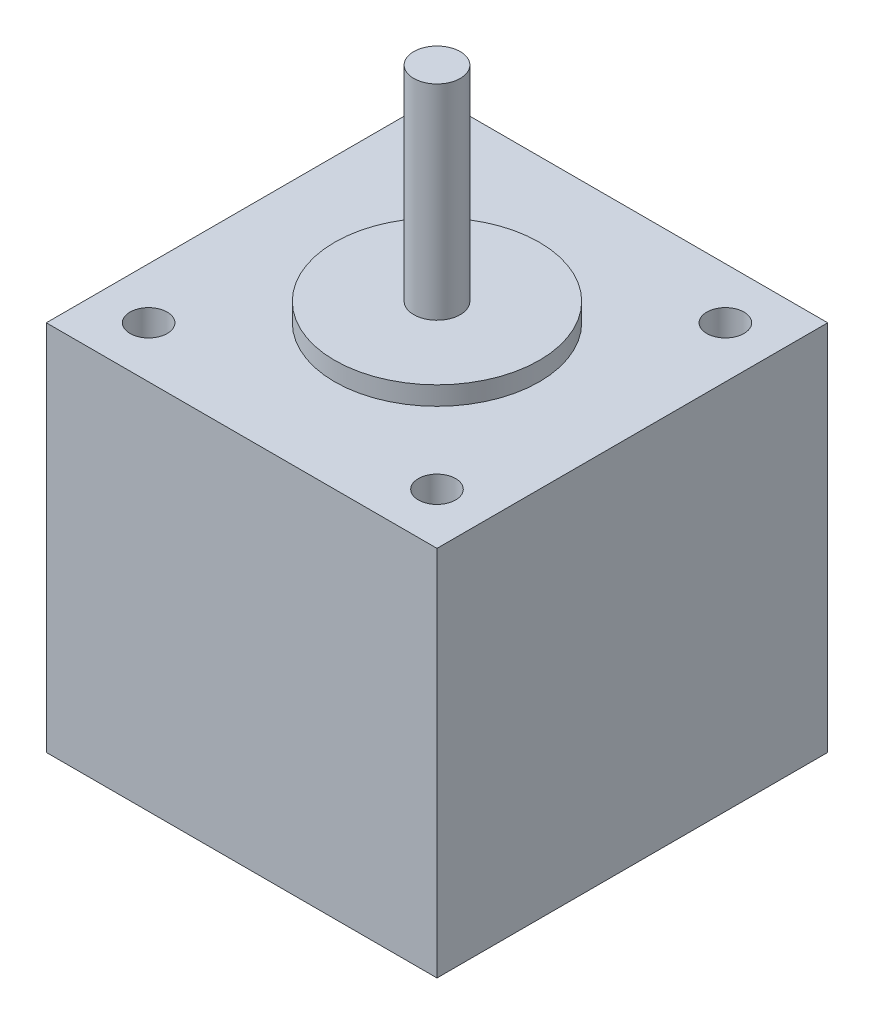
ISO-10303-21;
HEADER;
FILE_DESCRIPTION(('STEP AP214'),'2;1');
FILE_NAME('part.step','',(''),(''),'','','');
FILE_SCHEMA(('AUTOMOTIVE_DESIGN { 1 0 10303 214 1 1 1 1 }'));
ENDSEC;
DATA;
#1=APPLICATION_CONTEXT('core data for automotive mechanical design processes');
#2=APPLICATION_PROTOCOL_DEFINITION('international standard','automotive_design',2000,#1);
#3=PRODUCT_CONTEXT('',#1,'mechanical');
#4=PRODUCT('Part','Part','',(#3));
#5=PRODUCT_RELATED_PRODUCT_CATEGORY('part','',(#4));
#6=PRODUCT_DEFINITION_FORMATION('','',#4);
#7=PRODUCT_DEFINITION_CONTEXT('part definition',#1,'design');
#8=PRODUCT_DEFINITION('design','',#6,#7);
#9=PRODUCT_DEFINITION_SHAPE('','',#8);
#10=(LENGTH_UNIT() NAMED_UNIT(*) SI_UNIT(.MILLI.,.METRE.));
#11=(NAMED_UNIT(*) PLANE_ANGLE_UNIT() SI_UNIT($,.RADIAN.));
#12=(NAMED_UNIT(*) SI_UNIT($,.STERADIAN.) SOLID_ANGLE_UNIT());
#13=UNCERTAINTY_MEASURE_WITH_UNIT(LENGTH_MEASURE(1.E-05),#10,'distance_accuracy_value','');
#14=(GEOMETRIC_REPRESENTATION_CONTEXT(3) GLOBAL_UNCERTAINTY_ASSIGNED_CONTEXT((#13)) GLOBAL_UNIT_ASSIGNED_CONTEXT((#10,
#11,#12)) REPRESENTATION_CONTEXT('',''));
#15=CARTESIAN_POINT('',(0.,0.,0.));
#16=DIRECTION('',(0.,0.,1.));
#17=DIRECTION('',(1.,0.,0.));
#18=AXIS2_PLACEMENT_3D('',#15,#16,#17);
#19=CARTESIAN_POINT('',(21.,40.,21.));
#20=DIRECTION('',(-1.,0.,0.));
#21=DIRECTION('',(0.,0.,1.));
#22=AXIS2_PLACEMENT_3D('',#19,#20,#21);
#23=PLANE('',#22);
#24=DIRECTION('',(0.,0.,-1.));
#25=VECTOR('',#24,1.);
#26=CARTESIAN_POINT('',(21.,0.,21.));
#27=LINE('',#26,#25);
#28=CARTESIAN_POINT('',(21.,0.,21.));
#29=VERTEX_POINT('',#28);
#30=CARTESIAN_POINT('',(21.,0.,-21.));
#31=VERTEX_POINT('',#30);
#32=EDGE_CURVE('E112',#29,#31,#27,.T.);
#33=ORIENTED_EDGE('',*,*,#32,.T.);
#34=DIRECTION('',(0.,-1.,0.));
#35=VECTOR('',#34,1.);
#36=CARTESIAN_POINT('',(21.,40.,-21.));
#37=LINE('',#36,#35);
#38=CARTESIAN_POINT('',(21.,40.,-21.));
#39=VERTEX_POINT('',#38);
#40=EDGE_CURVE('E101',#39,#31,#37,.T.);
#41=ORIENTED_EDGE('',*,*,#40,.F.);
#42=DIRECTION('',(0.,0.,-1.));
#43=VECTOR('',#42,1.);
#44=CARTESIAN_POINT('',(21.,40.,21.));
#45=LINE('',#44,#43);
#46=CARTESIAN_POINT('',(21.,40.,21.));
#47=VERTEX_POINT('',#46);
#48=EDGE_CURVE('E93',#47,#39,#45,.T.);
#49=ORIENTED_EDGE('',*,*,#48,.F.);
#50=DIRECTION('',(0.,-1.,0.));
#51=VECTOR('',#50,1.);
#52=CARTESIAN_POINT('',(21.,40.,21.));
#53=LINE('',#52,#51);
#54=EDGE_CURVE('E108',#47,#29,#53,.T.);
#55=ORIENTED_EDGE('',*,*,#54,.T.);
#56=EDGE_LOOP('',(#33,#41,#49,#55));
#57=FACE_BOUND('',#56,.T.);
#58=ADVANCED_FACE('F39',(#57),#23,.F.);
#59=CARTESIAN_POINT('',(-21.,40.,-21.));
#60=DIRECTION('',(0.,0.,1.));
#61=DIRECTION('',(1.,0.,0.));
#62=AXIS2_PLACEMENT_3D('',#59,#60,#61);
#63=PLANE('',#62);
#64=DIRECTION('',(-1.,0.,0.));
#65=VECTOR('',#64,1.);
#66=CARTESIAN_POINT('',(-21.,0.,-21.));
#67=LINE('',#66,#65);
#68=CARTESIAN_POINT('',(-21.,0.,-21.));
#69=VERTEX_POINT('',#68);
#70=EDGE_CURVE('E99',#31,#69,#67,.T.);
#71=ORIENTED_EDGE('',*,*,#70,.T.);
#72=DIRECTION('',(0.,-1.,0.));
#73=VECTOR('',#72,1.);
#74=CARTESIAN_POINT('',(-21.,40.,-21.));
#75=LINE('',#74,#73);
#76=CARTESIAN_POINT('',(-21.,40.,-21.));
#77=VERTEX_POINT('',#76);
#78=EDGE_CURVE('E97',#77,#69,#75,.T.);
#79=ORIENTED_EDGE('',*,*,#78,.F.);
#80=DIRECTION('',(-1.,0.,0.));
#81=VECTOR('',#80,1.);
#82=CARTESIAN_POINT('',(-21.,40.,-21.));
#83=LINE('',#82,#81);
#84=EDGE_CURVE('E88',#39,#77,#83,.T.);
#85=ORIENTED_EDGE('',*,*,#84,.F.);
#86=ORIENTED_EDGE('',*,*,#40,.T.);
#87=EDGE_LOOP('',(#71,#79,#85,#86));
#88=FACE_BOUND('',#87,.T.);
#89=ADVANCED_FACE('F98',(#88),#63,.F.);
#90=CARTESIAN_POINT('',(-21.,40.,21.));
#91=DIRECTION('',(1.,0.,0.));
#92=DIRECTION('',(0.,0.,-1.));
#93=AXIS2_PLACEMENT_3D('',#90,#91,#92);
#94=PLANE('',#93);
#95=DIRECTION('',(0.,0.,1.));
#96=VECTOR('',#95,1.);
#97=CARTESIAN_POINT('',(-21.,0.,21.));
#98=LINE('',#97,#96);
#99=CARTESIAN_POINT('',(-21.,0.,21.));
#100=VERTEX_POINT('',#99);
#101=EDGE_CURVE('E74',#69,#100,#98,.T.);
#102=ORIENTED_EDGE('',*,*,#101,.T.);
#103=DIRECTION('',(0.,-1.,0.));
#104=VECTOR('',#103,1.);
#105=CARTESIAN_POINT('',(-21.,40.,21.));
#106=LINE('',#105,#104);
#107=CARTESIAN_POINT('',(-21.,40.,21.));
#108=VERTEX_POINT('',#107);
#109=EDGE_CURVE('E102',#108,#100,#106,.T.);
#110=ORIENTED_EDGE('',*,*,#109,.F.);
#111=DIRECTION('',(0.,0.,1.));
#112=VECTOR('',#111,1.);
#113=CARTESIAN_POINT('',(-21.,40.,21.));
#114=LINE('',#113,#112);
#115=EDGE_CURVE('E91',#77,#108,#114,.T.);
#116=ORIENTED_EDGE('',*,*,#115,.F.);
#117=ORIENTED_EDGE('',*,*,#78,.T.);
#118=EDGE_LOOP('',(#102,#110,#116,#117));
#119=FACE_BOUND('',#118,.T.);
#120=ADVANCED_FACE('F104',(#119),#94,.F.);
#121=CARTESIAN_POINT('',(-21.,40.,21.));
#122=DIRECTION('',(0.,0.,-1.));
#123=DIRECTION('',(-1.,0.,0.));
#124=AXIS2_PLACEMENT_3D('',#121,#122,#123);
#125=PLANE('',#124);
#126=DIRECTION('',(1.,0.,0.));
#127=VECTOR('',#126,1.);
#128=CARTESIAN_POINT('',(-21.,0.,21.));
#129=LINE('',#128,#127);
#130=EDGE_CURVE('E80',#100,#29,#129,.T.);
#131=ORIENTED_EDGE('',*,*,#130,.T.);
#132=ORIENTED_EDGE('',*,*,#54,.F.);
#133=DIRECTION('',(1.,0.,0.));
#134=VECTOR('',#133,1.);
#135=CARTESIAN_POINT('',(-21.,40.,21.));
#136=LINE('',#135,#134);
#137=EDGE_CURVE('E57',#108,#47,#136,.T.);
#138=ORIENTED_EDGE('',*,*,#137,.F.);
#139=ORIENTED_EDGE('',*,*,#109,.T.);
#140=EDGE_LOOP('',(#131,#132,#138,#139));
#141=FACE_BOUND('',#140,.T.);
#142=ADVANCED_FACE('F136',(#141),#125,.F.);
#143=CARTESIAN_POINT('',(0.,40.,0.));
#144=DIRECTION('',(0.,-1.,0.));
#145=DIRECTION('',(0.,0.,-1.));
#146=AXIS2_PLACEMENT_3D('',#143,#144,#145);
#147=PLANE('',#146);
#148=CARTESIAN_POINT('',(0.,40.,0.));
#149=DIRECTION('',(0.,-1.,0.));
#150=DIRECTION('',(0.,0.,-1.));
#151=AXIS2_PLACEMENT_3D('',#148,#149,#150);
#152=CIRCLE('',#151,11.);
#153=CARTESIAN_POINT('',(0.,40.,-11.));
#154=VERTEX_POINT('',#153);
#155=EDGE_CURVE('E42',#154,#154,#152,.F.);
#156=ORIENTED_EDGE('',*,*,#155,.F.);
#157=EDGE_LOOP('',(#156));
#158=FACE_BOUND('',#157,.T.);
#159=CARTESIAN_POINT('',(15.5,40.,-15.5));
#160=DIRECTION('',(0.,1.,0.));
#161=DIRECTION('',(0.,0.,1.));
#162=AXIS2_PLACEMENT_3D('',#159,#160,#161);
#163=CIRCLE('',#162,2.00000000000001);
#164=CARTESIAN_POINT('',(15.5,40.,-13.5));
#165=VERTEX_POINT('',#164);
#166=EDGE_CURVE('E141',#165,#165,#163,.T.);
#167=ORIENTED_EDGE('',*,*,#166,.F.);
#168=EDGE_LOOP('',(#167));
#169=FACE_BOUND('',#168,.T.);
#170=CARTESIAN_POINT('',(-15.5,40.,15.5));
#171=DIRECTION('',(0.,1.,0.));
#172=DIRECTION('',(0.,0.,1.));
#173=AXIS2_PLACEMENT_3D('',#170,#171,#172);
#174=CIRCLE('',#173,2.);
#175=CARTESIAN_POINT('',(-15.5,40.,17.5));
#176=VERTEX_POINT('',#175);
#177=EDGE_CURVE('E145',#176,#176,#174,.T.);
#178=ORIENTED_EDGE('',*,*,#177,.F.);
#179=EDGE_LOOP('',(#178));
#180=FACE_BOUND('',#179,.T.);
#181=CARTESIAN_POINT('',(15.5,40.,15.5));
#182=DIRECTION('',(0.,1.,0.));
#183=DIRECTION('',(0.,0.,1.));
#184=AXIS2_PLACEMENT_3D('',#181,#182,#183);
#185=CIRCLE('',#184,2.);
#186=CARTESIAN_POINT('',(15.5,40.,17.5));
#187=VERTEX_POINT('',#186);
#188=EDGE_CURVE('E149',#187,#187,#185,.T.);
#189=ORIENTED_EDGE('',*,*,#188,.F.);
#190=EDGE_LOOP('',(#189));
#191=FACE_BOUND('',#190,.T.);
#192=CARTESIAN_POINT('',(-15.5,40.,-15.5));
#193=DIRECTION('',(0.,1.,0.));
#194=DIRECTION('',(0.,0.,1.));
#195=AXIS2_PLACEMENT_3D('',#192,#193,#194);
#196=CIRCLE('',#195,2.);
#197=CARTESIAN_POINT('',(-15.5,40.,-13.5));
#198=VERTEX_POINT('',#197);
#199=EDGE_CURVE('E152',#198,#198,#196,.T.);
#200=ORIENTED_EDGE('',*,*,#199,.F.);
#201=EDGE_LOOP('',(#200));
#202=FACE_BOUND('',#201,.T.);
#203=ORIENTED_EDGE('',*,*,#48,.T.);
#204=ORIENTED_EDGE('',*,*,#84,.T.);
#205=ORIENTED_EDGE('',*,*,#115,.T.);
#206=ORIENTED_EDGE('',*,*,#137,.T.);
#207=EDGE_LOOP('',(#203,#204,#205,#206));
#208=FACE_BOUND('',#207,.T.);
#209=ADVANCED_FACE('F89',(#158,#169,#180,#191,#202,#208),#147,.F.);
#210=CARTESIAN_POINT('',(0.,0.,0.));
#211=DIRECTION('',(0.,-1.,0.));
#212=DIRECTION('',(0.,0.,-1.));
#213=AXIS2_PLACEMENT_3D('',#210,#211,#212);
#214=PLANE('',#213);
#215=ORIENTED_EDGE('',*,*,#32,.F.);
#216=ORIENTED_EDGE('',*,*,#130,.F.);
#217=ORIENTED_EDGE('',*,*,#101,.F.);
#218=ORIENTED_EDGE('',*,*,#70,.F.);
#219=EDGE_LOOP('',(#215,#216,#217,#218));
#220=FACE_BOUND('',#219,.T.);
#221=ADVANCED_FACE('F135',(#220),#214,.T.);
#222=CARTESIAN_POINT('',(-15.5,35.5,-15.5));
#223=DIRECTION('',(0.,1.,0.));
#224=DIRECTION('',(0.,0.,1.));
#225=AXIS2_PLACEMENT_3D('',#222,#223,#224);
#226=CYLINDRICAL_SURFACE('',#225,2.);
#227=CARTESIAN_POINT('',(-15.5,35.5,-15.5));
#228=DIRECTION('',(0.,1.,0.));
#229=DIRECTION('',(0.,0.,1.));
#230=AXIS2_PLACEMENT_3D('',#227,#228,#229);
#231=CIRCLE('',#230,2.);
#232=CARTESIAN_POINT('',(-15.5,35.5,-13.5));
#233=VERTEX_POINT('',#232);
#234=EDGE_CURVE('E116',#233,#233,#231,.T.);
#235=ORIENTED_EDGE('',*,*,#234,.F.);
#236=EDGE_LOOP('',(#235));
#237=FACE_BOUND('',#236,.T.);
#238=ORIENTED_EDGE('',*,*,#199,.T.);
#239=EDGE_LOOP('',(#238));
#240=FACE_BOUND('',#239,.T.);
#241=ADVANCED_FACE('F220',(#237,#240),#226,.F.);
#242=CARTESIAN_POINT('',(-15.5,35.5,-15.5));
#243=DIRECTION('',(0.,1.,0.));
#244=DIRECTION('',(0.,0.,1.));
#245=AXIS2_PLACEMENT_3D('',#242,#243,#244);
#246=PLANE('',#245);
#247=ORIENTED_EDGE('',*,*,#234,.T.);
#248=EDGE_LOOP('',(#247));
#249=FACE_BOUND('',#248,.T.);
#250=ADVANCED_FACE('F225',(#249),#246,.T.);
#251=CARTESIAN_POINT('',(15.5,35.5,15.5));
#252=DIRECTION('',(0.,1.,0.));
#253=DIRECTION('',(0.,0.,1.));
#254=AXIS2_PLACEMENT_3D('',#251,#252,#253);
#255=CYLINDRICAL_SURFACE('',#254,2.);
#256=CARTESIAN_POINT('',(15.5,35.5,15.5));
#257=DIRECTION('',(0.,1.,0.));
#258=DIRECTION('',(0.,0.,1.));
#259=AXIS2_PLACEMENT_3D('',#256,#257,#258);
#260=CIRCLE('',#259,2.);
#261=CARTESIAN_POINT('',(15.5,35.5,17.5));
#262=VERTEX_POINT('',#261);
#263=EDGE_CURVE('E168',#262,#262,#260,.T.);
#264=ORIENTED_EDGE('',*,*,#263,.F.);
#265=EDGE_LOOP('',(#264));
#266=FACE_BOUND('',#265,.T.);
#267=ORIENTED_EDGE('',*,*,#188,.T.);
#268=EDGE_LOOP('',(#267));
#269=FACE_BOUND('',#268,.T.);
#270=ADVANCED_FACE('F311',(#266,#269),#255,.F.);
#271=CARTESIAN_POINT('',(15.5,35.5,15.5));
#272=DIRECTION('',(0.,1.,0.));
#273=DIRECTION('',(0.,0.,1.));
#274=AXIS2_PLACEMENT_3D('',#271,#272,#273);
#275=PLANE('',#274);
#276=ORIENTED_EDGE('',*,*,#263,.T.);
#277=EDGE_LOOP('',(#276));
#278=FACE_BOUND('',#277,.T.);
#279=ADVANCED_FACE('F302',(#278),#275,.T.);
#280=CARTESIAN_POINT('',(-15.5,35.5,15.5));
#281=DIRECTION('',(0.,1.,0.));
#282=DIRECTION('',(0.,0.,1.));
#283=AXIS2_PLACEMENT_3D('',#280,#281,#282);
#284=CYLINDRICAL_SURFACE('',#283,2.);
#285=CARTESIAN_POINT('',(-15.5,35.5,15.5));
#286=DIRECTION('',(0.,1.,0.));
#287=DIRECTION('',(0.,0.,1.));
#288=AXIS2_PLACEMENT_3D('',#285,#286,#287);
#289=CIRCLE('',#288,2.);
#290=CARTESIAN_POINT('',(-15.5,35.5,17.5));
#291=VERTEX_POINT('',#290);
#292=EDGE_CURVE('E167',#291,#291,#289,.T.);
#293=ORIENTED_EDGE('',*,*,#292,.F.);
#294=EDGE_LOOP('',(#293));
#295=FACE_BOUND('',#294,.T.);
#296=ORIENTED_EDGE('',*,*,#177,.T.);
#297=EDGE_LOOP('',(#296));
#298=FACE_BOUND('',#297,.T.);
#299=ADVANCED_FACE('F293',(#295,#298),#284,.F.);
#300=CARTESIAN_POINT('',(-15.5,35.5,15.5));
#301=DIRECTION('',(0.,1.,0.));
#302=DIRECTION('',(0.,0.,1.));
#303=AXIS2_PLACEMENT_3D('',#300,#301,#302);
#304=PLANE('',#303);
#305=ORIENTED_EDGE('',*,*,#292,.T.);
#306=EDGE_LOOP('',(#305));
#307=FACE_BOUND('',#306,.T.);
#308=ADVANCED_FACE('F284',(#307),#304,.T.);
#309=CARTESIAN_POINT('',(15.5,35.5,-15.5));
#310=DIRECTION('',(0.,1.,0.));
#311=DIRECTION('',(0.,0.,1.));
#312=AXIS2_PLACEMENT_3D('',#309,#310,#311);
#313=CYLINDRICAL_SURFACE('',#312,2.00000000000001);
#314=CARTESIAN_POINT('',(15.5,35.5,-15.5));
#315=DIRECTION('',(0.,1.,0.));
#316=DIRECTION('',(0.,0.,1.));
#317=AXIS2_PLACEMENT_3D('',#314,#315,#316);
#318=CIRCLE('',#317,2.00000000000001);
#319=CARTESIAN_POINT('',(15.5,35.5,-13.5));
#320=VERTEX_POINT('',#319);
#321=EDGE_CURVE('E155',#320,#320,#318,.T.);
#322=ORIENTED_EDGE('',*,*,#321,.F.);
#323=EDGE_LOOP('',(#322));
#324=FACE_BOUND('',#323,.T.);
#325=ORIENTED_EDGE('',*,*,#166,.T.);
#326=EDGE_LOOP('',(#325));
#327=FACE_BOUND('',#326,.T.);
#328=ADVANCED_FACE('F208',(#324,#327),#313,.F.);
#329=CARTESIAN_POINT('',(15.5,35.5,-15.5));
#330=DIRECTION('',(0.,1.,0.));
#331=DIRECTION('',(0.,0.,1.));
#332=AXIS2_PLACEMENT_3D('',#329,#330,#331);
#333=PLANE('',#332);
#334=ORIENTED_EDGE('',*,*,#321,.T.);
#335=EDGE_LOOP('',(#334));
#336=FACE_BOUND('',#335,.T.);
#337=ADVANCED_FACE('F203',(#336),#333,.T.);
#338=CARTESIAN_POINT('',(0.,42.,0.));
#339=DIRECTION('',(0.,-1.,0.));
#340=DIRECTION('',(0.,0.,-1.));
#341=AXIS2_PLACEMENT_3D('',#338,#339,#340);
#342=CYLINDRICAL_SURFACE('',#341,11.);
#343=CARTESIAN_POINT('',(0.,42.,0.));
#344=DIRECTION('',(0.,1.,0.));
#345=DIRECTION('',(0.,0.,1.));
#346=AXIS2_PLACEMENT_3D('',#343,#344,#345);
#347=CIRCLE('',#346,11.);
#348=CARTESIAN_POINT('',(0.,42.,11.));
#349=VERTEX_POINT('',#348);
#350=EDGE_CURVE('E176',#349,#349,#347,.T.);
#351=ORIENTED_EDGE('',*,*,#350,.F.);
#352=EDGE_LOOP('',(#351));
#353=FACE_BOUND('',#352,.T.);
#354=ORIENTED_EDGE('',*,*,#155,.T.);
#355=EDGE_LOOP('',(#354));
#356=FACE_BOUND('',#355,.T.);
#357=ADVANCED_FACE('F131',(#353,#356),#342,.T.);
#358=CARTESIAN_POINT('',(0.,42.,0.));
#359=DIRECTION('',(0.,1.,0.));
#360=DIRECTION('',(0.,0.,1.));
#361=AXIS2_PLACEMENT_3D('',#358,#359,#360);
#362=PLANE('',#361);
#363=CARTESIAN_POINT('',(0.,42.,0.));
#364=DIRECTION('',(0.,1.,0.));
#365=DIRECTION('',(0.,0.,1.));
#366=AXIS2_PLACEMENT_3D('',#363,#364,#365);
#367=CIRCLE('',#366,2.5);
#368=CARTESIAN_POINT('',(0.,42.,2.5));
#369=VERTEX_POINT('',#368);
#370=EDGE_CURVE('E11',#369,#369,#367,.T.);
#371=ORIENTED_EDGE('',*,*,#370,.F.);
#372=EDGE_LOOP('',(#371));
#373=FACE_BOUND('',#372,.T.);
#374=ORIENTED_EDGE('',*,*,#350,.T.);
#375=EDGE_LOOP('',(#374));
#376=FACE_BOUND('',#375,.T.);
#377=ADVANCED_FACE('F193',(#373,#376),#362,.T.);
#378=CARTESIAN_POINT('',(0.,64.,0.));
#379=DIRECTION('',(0.,-1.,0.));
#380=DIRECTION('',(0.,0.,-1.));
#381=AXIS2_PLACEMENT_3D('',#378,#379,#380);
#382=CYLINDRICAL_SURFACE('',#381,2.5);
#383=CARTESIAN_POINT('',(0.,64.,0.));
#384=DIRECTION('',(0.,1.,0.));
#385=DIRECTION('',(0.,0.,1.));
#386=AXIS2_PLACEMENT_3D('',#383,#384,#385);
#387=CIRCLE('',#386,2.5);
#388=CARTESIAN_POINT('',(0.,64.,2.5));
#389=VERTEX_POINT('',#388);
#390=EDGE_CURVE('E182',#389,#389,#387,.T.);
#391=ORIENTED_EDGE('',*,*,#390,.F.);
#392=EDGE_LOOP('',(#391));
#393=FACE_BOUND('',#392,.T.);
#394=ORIENTED_EDGE('',*,*,#370,.T.);
#395=EDGE_LOOP('',(#394));
#396=FACE_BOUND('',#395,.T.);
#397=ADVANCED_FACE('F190',(#393,#396),#382,.T.);
#398=CARTESIAN_POINT('',(0.,64.,0.));
#399=DIRECTION('',(0.,1.,0.));
#400=DIRECTION('',(0.,0.,1.));
#401=AXIS2_PLACEMENT_3D('',#398,#399,#400);
#402=PLANE('',#401);
#403=ORIENTED_EDGE('',*,*,#390,.T.);
#404=EDGE_LOOP('',(#403));
#405=FACE_BOUND('',#404,.T.);
#406=ADVANCED_FACE('F188',(#405),#402,.T.);
#407=CLOSED_SHELL('',(#58,#89,#120,#142,#209,#221,#241,#250,#270,#279,#299,#308,#328,#337,#357,
#377,#397,#406));
#408=MANIFOLD_SOLID_BREP('B2',#407);
#409=ADVANCED_BREP_SHAPE_REPRESENTATION('',(#18,#408),#14);
#410=SHAPE_DEFINITION_REPRESENTATION(#9,#409);
ENDSEC;
END-ISO-10303-21;
